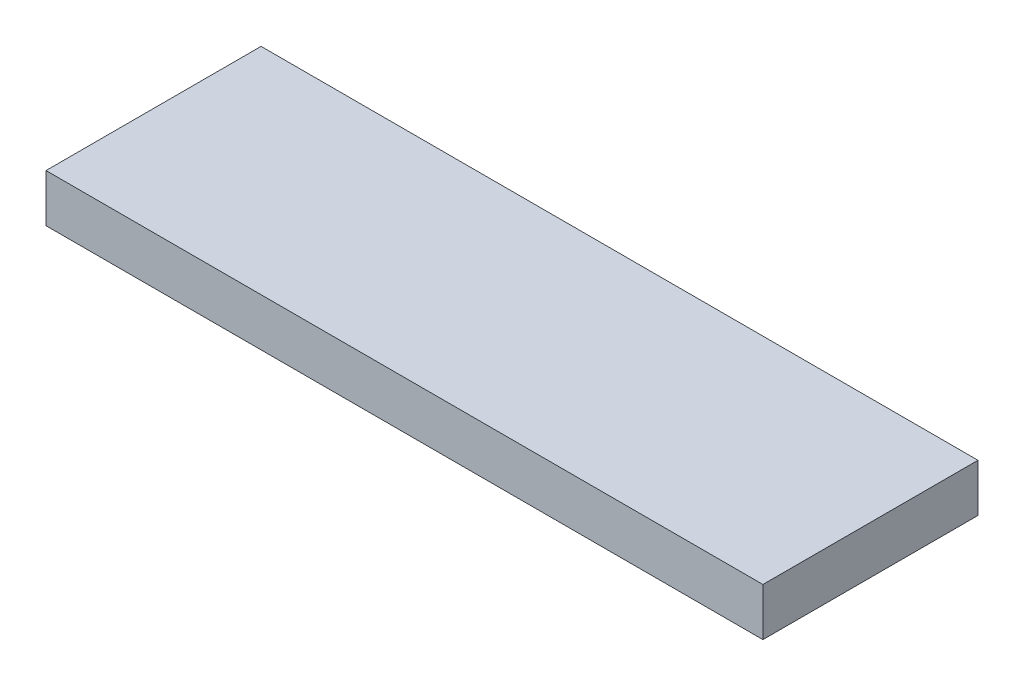
ISO-10303-21;
HEADER;
FILE_DESCRIPTION(('STEP AP214'),'2;1');
FILE_NAME('part.step','',(''),(''),'','','');
FILE_SCHEMA(('AUTOMOTIVE_DESIGN { 1 0 10303 214 1 1 1 1 }'));
ENDSEC;
DATA;
#1=APPLICATION_CONTEXT('core data for automotive mechanical design processes');
#2=APPLICATION_PROTOCOL_DEFINITION('international standard','automotive_design',2000,#1);
#3=PRODUCT_CONTEXT('',#1,'mechanical');
#4=PRODUCT('Part','Part','',(#3));
#5=PRODUCT_RELATED_PRODUCT_CATEGORY('part','',(#4));
#6=PRODUCT_DEFINITION_FORMATION('','',#4);
#7=PRODUCT_DEFINITION_CONTEXT('part definition',#1,'design');
#8=PRODUCT_DEFINITION('design','',#6,#7);
#9=PRODUCT_DEFINITION_SHAPE('','',#8);
#10=(LENGTH_UNIT() NAMED_UNIT(*) SI_UNIT(.MILLI.,.METRE.));
#11=(NAMED_UNIT(*) PLANE_ANGLE_UNIT() SI_UNIT($,.RADIAN.));
#12=(NAMED_UNIT(*) SI_UNIT($,.STERADIAN.) SOLID_ANGLE_UNIT());
#13=UNCERTAINTY_MEASURE_WITH_UNIT(LENGTH_MEASURE(1.E-05),#10,'distance_accuracy_value','');
#14=(GEOMETRIC_REPRESENTATION_CONTEXT(3) GLOBAL_UNCERTAINTY_ASSIGNED_CONTEXT((#13)) GLOBAL_UNIT_ASSIGNED_CONTEXT((#10,
#11,#12)) REPRESENTATION_CONTEXT('',''));
#15=CARTESIAN_POINT('',(0.,0.,0.));
#16=DIRECTION('',(0.,0.,1.));
#17=DIRECTION('',(1.,0.,0.));
#18=AXIS2_PLACEMENT_3D('',#15,#16,#17);
#19=CARTESIAN_POINT('',(75.,10.,-22.5));
#20=DIRECTION('',(-1.,0.,0.));
#21=DIRECTION('',(0.,0.,1.));
#22=AXIS2_PLACEMENT_3D('',#19,#20,#21);
#23=PLANE('',#22);
#24=DIRECTION('',(0.,0.,-1.));
#25=VECTOR('',#24,1.);
#26=CARTESIAN_POINT('',(75.,0.,-22.5));
#27=LINE('',#26,#25);
#28=CARTESIAN_POINT('',(75.,0.,22.5));
#29=VERTEX_POINT('',#28);
#30=CARTESIAN_POINT('',(75.,0.,-22.5));
#31=VERTEX_POINT('',#30);
#32=EDGE_CURVE('E96',#29,#31,#27,.T.);
#33=ORIENTED_EDGE('',*,*,#32,.T.);
#34=DIRECTION('',(0.,-1.,0.));
#35=VECTOR('',#34,1.);
#36=CARTESIAN_POINT('',(75.,10.,-22.5));
#37=LINE('',#36,#35);
#38=CARTESIAN_POINT('',(75.,10.,-22.5));
#39=VERTEX_POINT('',#38);
#40=EDGE_CURVE('E11',#39,#31,#37,.T.);
#41=ORIENTED_EDGE('',*,*,#40,.F.);
#42=DIRECTION('',(0.,0.,-1.));
#43=VECTOR('',#42,1.);
#44=CARTESIAN_POINT('',(75.,10.,-22.5));
#45=LINE('',#44,#43);
#46=CARTESIAN_POINT('',(75.,10.,22.5));
#47=VERTEX_POINT('',#46);
#48=EDGE_CURVE('E84',#47,#39,#45,.T.);
#49=ORIENTED_EDGE('',*,*,#48,.F.);
#50=DIRECTION('',(0.,-1.,0.));
#51=VECTOR('',#50,1.);
#52=CARTESIAN_POINT('',(75.,10.,22.5));
#53=LINE('',#52,#51);
#54=EDGE_CURVE('E92',#47,#29,#53,.T.);
#55=ORIENTED_EDGE('',*,*,#54,.T.);
#56=EDGE_LOOP('',(#33,#41,#49,#55));
#57=FACE_BOUND('',#56,.T.);
#58=ADVANCED_FACE('F33',(#57),#23,.F.);
#59=CARTESIAN_POINT('',(-75.,10.,-22.5));
#60=DIRECTION('',(0.,0.,1.));
#61=DIRECTION('',(1.,0.,0.));
#62=AXIS2_PLACEMENT_3D('',#59,#60,#61);
#63=PLANE('',#62);
#64=DIRECTION('',(-1.,0.,0.));
#65=VECTOR('',#64,1.);
#66=CARTESIAN_POINT('',(-75.,0.,-22.5));
#67=LINE('',#66,#65);
#68=CARTESIAN_POINT('',(-75.,0.,-22.5));
#69=VERTEX_POINT('',#68);
#70=EDGE_CURVE('E88',#31,#69,#67,.T.);
#71=ORIENTED_EDGE('',*,*,#70,.T.);
#72=DIRECTION('',(0.,-1.,0.));
#73=VECTOR('',#72,1.);
#74=CARTESIAN_POINT('',(-75.,10.,-22.5));
#75=LINE('',#74,#73);
#76=CARTESIAN_POINT('',(-75.,10.,-22.5));
#77=VERTEX_POINT('',#76);
#78=EDGE_CURVE('E41',#77,#69,#75,.T.);
#79=ORIENTED_EDGE('',*,*,#78,.F.);
#80=DIRECTION('',(-1.,0.,0.));
#81=VECTOR('',#80,1.);
#82=CARTESIAN_POINT('',(-75.,10.,-22.5));
#83=LINE('',#82,#81);
#84=EDGE_CURVE('E79',#39,#77,#83,.T.);
#85=ORIENTED_EDGE('',*,*,#84,.F.);
#86=ORIENTED_EDGE('',*,*,#40,.T.);
#87=EDGE_LOOP('',(#71,#79,#85,#86));
#88=FACE_BOUND('',#87,.T.);
#89=ADVANCED_FACE('F87',(#88),#63,.F.);
#90=CARTESIAN_POINT('',(-75.,10.,-22.5));
#91=DIRECTION('',(1.,0.,0.));
#92=DIRECTION('',(0.,0.,-1.));
#93=AXIS2_PLACEMENT_3D('',#90,#91,#92);
#94=PLANE('',#93);
#95=DIRECTION('',(0.,0.,1.));
#96=VECTOR('',#95,1.);
#97=CARTESIAN_POINT('',(-75.,0.,-22.5));
#98=LINE('',#97,#96);
#99=CARTESIAN_POINT('',(-75.,0.,22.5));
#100=VERTEX_POINT('',#99);
#101=EDGE_CURVE('E66',#69,#100,#98,.T.);
#102=ORIENTED_EDGE('',*,*,#101,.T.);
#103=DIRECTION('',(0.,-1.,0.));
#104=VECTOR('',#103,1.);
#105=CARTESIAN_POINT('',(-75.,10.,22.5));
#106=LINE('',#105,#104);
#107=CARTESIAN_POINT('',(-75.,10.,22.5));
#108=VERTEX_POINT('',#107);
#109=EDGE_CURVE('E89',#108,#100,#106,.T.);
#110=ORIENTED_EDGE('',*,*,#109,.F.);
#111=DIRECTION('',(0.,0.,1.));
#112=VECTOR('',#111,1.);
#113=CARTESIAN_POINT('',(-75.,10.,-22.5));
#114=LINE('',#113,#112);
#115=EDGE_CURVE('E82',#77,#108,#114,.T.);
#116=ORIENTED_EDGE('',*,*,#115,.F.);
#117=ORIENTED_EDGE('',*,*,#78,.T.);
#118=EDGE_LOOP('',(#102,#110,#116,#117));
#119=FACE_BOUND('',#118,.T.);
#120=ADVANCED_FACE('F90',(#119),#94,.F.);
#121=CARTESIAN_POINT('',(-75.,10.,22.5));
#122=DIRECTION('',(0.,0.,-1.));
#123=DIRECTION('',(-1.,0.,0.));
#124=AXIS2_PLACEMENT_3D('',#121,#122,#123);
#125=PLANE('',#124);
#126=DIRECTION('',(1.,0.,0.));
#127=VECTOR('',#126,1.);
#128=CARTESIAN_POINT('',(-75.,0.,22.5));
#129=LINE('',#128,#127);
#130=EDGE_CURVE('E72',#100,#29,#129,.T.);
#131=ORIENTED_EDGE('',*,*,#130,.T.);
#132=ORIENTED_EDGE('',*,*,#54,.F.);
#133=DIRECTION('',(1.,0.,0.));
#134=VECTOR('',#133,1.);
#135=CARTESIAN_POINT('',(-75.,10.,22.5));
#136=LINE('',#135,#134);
#137=EDGE_CURVE('E49',#108,#47,#136,.T.);
#138=ORIENTED_EDGE('',*,*,#137,.F.);
#139=ORIENTED_EDGE('',*,*,#109,.T.);
#140=EDGE_LOOP('',(#131,#132,#138,#139));
#141=FACE_BOUND('',#140,.T.);
#142=ADVANCED_FACE('F103',(#141),#125,.F.);
#143=CARTESIAN_POINT('',(0.,10.,0.));
#144=DIRECTION('',(0.,1.,0.));
#145=DIRECTION('',(0.,0.,1.));
#146=AXIS2_PLACEMENT_3D('',#143,#144,#145);
#147=PLANE('',#146);
#148=ORIENTED_EDGE('',*,*,#48,.T.);
#149=ORIENTED_EDGE('',*,*,#84,.T.);
#150=ORIENTED_EDGE('',*,*,#115,.T.);
#151=ORIENTED_EDGE('',*,*,#137,.T.);
#152=EDGE_LOOP('',(#148,#149,#150,#151));
#153=FACE_BOUND('',#152,.T.);
#154=ADVANCED_FACE('F80',(#153),#147,.T.);
#155=CARTESIAN_POINT('',(0.,0.,0.));
#156=DIRECTION('',(0.,1.,0.));
#157=DIRECTION('',(0.,0.,1.));
#158=AXIS2_PLACEMENT_3D('',#155,#156,#157);
#159=PLANE('',#158);
#160=ORIENTED_EDGE('',*,*,#32,.F.);
#161=ORIENTED_EDGE('',*,*,#130,.F.);
#162=ORIENTED_EDGE('',*,*,#101,.F.);
#163=ORIENTED_EDGE('',*,*,#70,.F.);
#164=EDGE_LOOP('',(#160,#161,#162,#163));
#165=FACE_BOUND('',#164,.T.);
#166=ADVANCED_FACE('F106',(#165),#159,.F.);
#167=CLOSED_SHELL('',(#58,#89,#120,#142,#154,#166));
#168=MANIFOLD_SOLID_BREP('B2',#167);
#169=ADVANCED_BREP_SHAPE_REPRESENTATION('',(#18,#168),#14);
#170=SHAPE_DEFINITION_REPRESENTATION(#9,#169);
ENDSEC;
END-ISO-10303-21;
